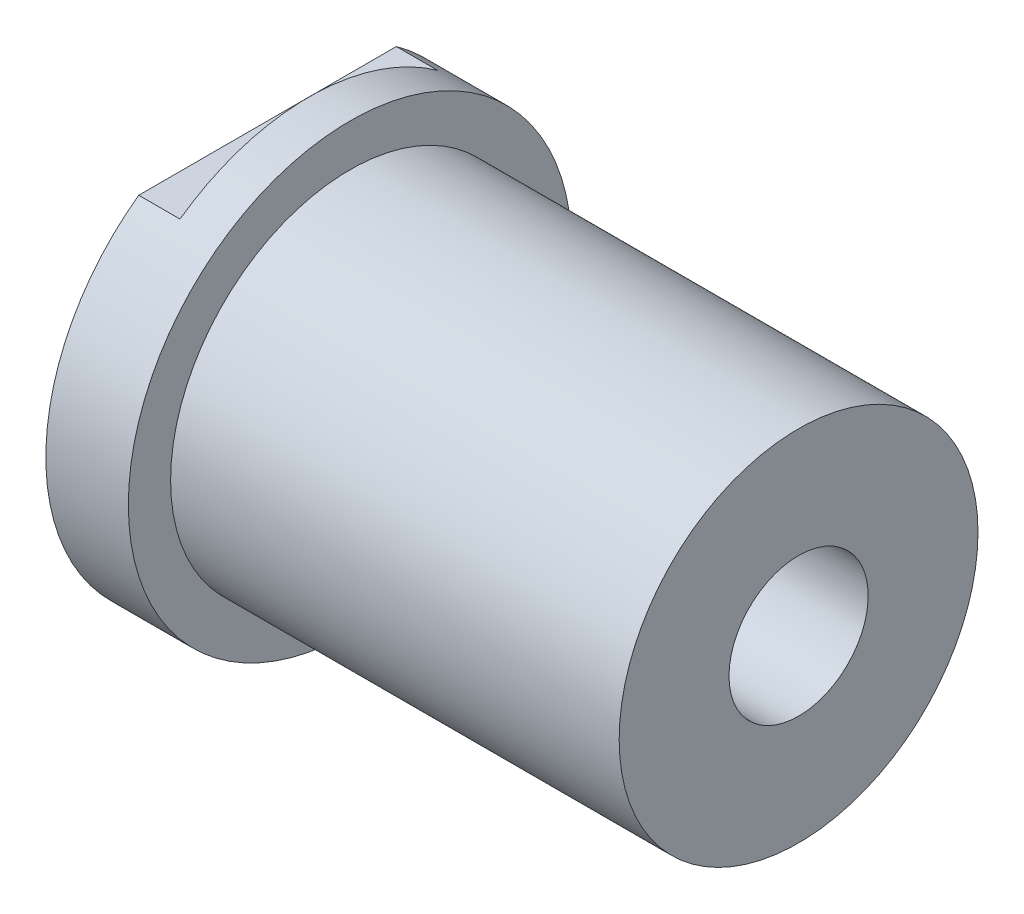
ISO-10303-21;
HEADER;
FILE_DESCRIPTION(('STEP AP214'),'2;1');
FILE_NAME('part.step','',(''),(''),'','','');
FILE_SCHEMA(('AUTOMOTIVE_DESIGN { 1 0 10303 214 1 1 1 1 }'));
ENDSEC;
DATA;
#1=APPLICATION_CONTEXT('core data for automotive mechanical design processes');
#2=APPLICATION_PROTOCOL_DEFINITION('international standard','automotive_design',2000,#1);
#3=PRODUCT_CONTEXT('',#1,'mechanical');
#4=PRODUCT('Part','Part','',(#3));
#5=PRODUCT_RELATED_PRODUCT_CATEGORY('part','',(#4));
#6=PRODUCT_DEFINITION_FORMATION('','',#4);
#7=PRODUCT_DEFINITION_CONTEXT('part definition',#1,'design');
#8=PRODUCT_DEFINITION('design','',#6,#7);
#9=PRODUCT_DEFINITION_SHAPE('','',#8);
#10=(LENGTH_UNIT() NAMED_UNIT(*) SI_UNIT(.MILLI.,.METRE.));
#11=(NAMED_UNIT(*) PLANE_ANGLE_UNIT() SI_UNIT($,.RADIAN.));
#12=(NAMED_UNIT(*) SI_UNIT($,.STERADIAN.) SOLID_ANGLE_UNIT());
#13=UNCERTAINTY_MEASURE_WITH_UNIT(LENGTH_MEASURE(1.E-05),#10,'distance_accuracy_value','');
#14=(GEOMETRIC_REPRESENTATION_CONTEXT(3) GLOBAL_UNCERTAINTY_ASSIGNED_CONTEXT((#13)) GLOBAL_UNIT_ASSIGNED_CONTEXT((#10,
#11,#12)) REPRESENTATION_CONTEXT('',''));
#15=CARTESIAN_POINT('',(0.,0.,0.));
#16=DIRECTION('',(0.,0.,1.));
#17=DIRECTION('',(1.,0.,0.));
#18=AXIS2_PLACEMENT_3D('',#15,#16,#17);
#19=CARTESIAN_POINT('',(0.,0.,0.));
#20=DIRECTION('',(-1.,0.,0.));
#21=DIRECTION('',(0.,0.,1.));
#22=AXIS2_PLACEMENT_3D('',#19,#20,#21);
#23=PLANE('',#22);
#24=CARTESIAN_POINT('',(0.,0.,0.));
#25=DIRECTION('',(-1.,0.,0.));
#26=DIRECTION('',(0.,0.,1.));
#27=AXIS2_PLACEMENT_3D('',#24,#25,#26);
#28=CIRCLE('',#27,19.5);
#29=CARTESIAN_POINT('',(0.,0.,19.5));
#30=VERTEX_POINT('',#29);
#31=EDGE_CURVE('E158',#30,#30,#28,.T.);
#32=ORIENTED_EDGE('',*,*,#31,.F.);
#33=EDGE_LOOP('',(#32));
#34=FACE_BOUND('',#33,.T.);
#35=CARTESIAN_POINT('',(0.,0.,0.));
#36=DIRECTION('',(1.,0.,0.));
#37=DIRECTION('',(0.,0.,-1.));
#38=AXIS2_PLACEMENT_3D('',#35,#36,#37);
#39=CIRCLE('',#38,43.);
#40=CARTESIAN_POINT('',(0.,-35.,-24.9799919935936));
#41=VERTEX_POINT('',#40);
#42=CARTESIAN_POINT('',(0.,35.,-24.9799919935936));
#43=VERTEX_POINT('',#42);
#44=EDGE_CURVE('E49',#41,#43,#39,.T.);
#45=ORIENTED_EDGE('',*,*,#44,.F.);
#46=DIRECTION('',(0.,0.,1.));
#47=VECTOR('',#46,1.);
#48=CARTESIAN_POINT('',(0.,-35.,-24.9799919935936));
#49=LINE('',#48,#47);
#50=CARTESIAN_POINT('',(0.,-35.,24.9799919935936));
#51=VERTEX_POINT('',#50);
#52=EDGE_CURVE('E102',#41,#51,#49,.T.);
#53=ORIENTED_EDGE('',*,*,#52,.T.);
#54=CARTESIAN_POINT('',(0.,35.,24.9799919935936));
#55=VERTEX_POINT('',#54);
#56=EDGE_CURVE('E12',#55,#51,#39,.T.);
#57=ORIENTED_EDGE('',*,*,#56,.F.);
#58=DIRECTION('',(0.,0.,1.));
#59=VECTOR('',#58,1.);
#60=CARTESIAN_POINT('',(0.,35.,-24.9799919935936));
#61=LINE('',#60,#59);
#62=EDGE_CURVE('E118',#43,#55,#61,.T.);
#63=ORIENTED_EDGE('',*,*,#62,.F.);
#64=EDGE_LOOP('',(#45,#53,#57,#63));
#65=FACE_BOUND('',#64,.T.);
#66=ADVANCED_FACE('F40',(#34,#65),#23,.T.);
#67=CARTESIAN_POINT('',(103.,0.,0.));
#68=DIRECTION('',(1.,0.,0.));
#69=DIRECTION('',(0.,0.,-1.));
#70=AXIS2_PLACEMENT_3D('',#67,#68,#69);
#71=CYLINDRICAL_SURFACE('',#70,43.);
#72=DIRECTION('',(1.,0.,0.));
#73=VECTOR('',#72,1.);
#74=CARTESIAN_POINT('',(-219.22113969155,-35.,-24.9799919935936));
#75=LINE('',#74,#73);
#76=CARTESIAN_POINT('',(7.99999999999999,-35.,-24.9799919935936));
#77=VERTEX_POINT('',#76);
#78=EDGE_CURVE('E56',#41,#77,#75,.T.);
#79=ORIENTED_EDGE('',*,*,#78,.F.);
#80=ORIENTED_EDGE('',*,*,#44,.T.);
#81=DIRECTION('',(1.,0.,0.));
#82=VECTOR('',#81,1.);
#83=CARTESIAN_POINT('',(-199.22113969155,35.,-24.9799919935936));
#84=LINE('',#83,#82);
#85=CARTESIAN_POINT('',(8.,35.,-24.9799919935936));
#86=VERTEX_POINT('',#85);
#87=EDGE_CURVE('E114',#43,#86,#84,.T.);
#88=ORIENTED_EDGE('',*,*,#87,.T.);
#89=CARTESIAN_POINT('',(8.,0.,0.));
#90=DIRECTION('',(1.,0.,0.));
#91=DIRECTION('',(0.,0.,-1.));
#92=AXIS2_PLACEMENT_3D('',#89,#90,#91);
#93=CIRCLE('',#92,43.);
#94=CARTESIAN_POINT('',(7.99999999999999,35.,24.9799919935936));
#95=VERTEX_POINT('',#94);
#96=EDGE_CURVE('E107',#86,#95,#93,.T.);
#97=ORIENTED_EDGE('',*,*,#96,.T.);
#98=DIRECTION('',(1.,0.,0.));
#99=VECTOR('',#98,1.);
#100=CARTESIAN_POINT('',(-199.22113969155,35.,24.9799919935936));
#101=LINE('',#100,#99);
#102=EDGE_CURVE('E64',#55,#95,#101,.T.);
#103=ORIENTED_EDGE('',*,*,#102,.F.);
#104=ORIENTED_EDGE('',*,*,#56,.T.);
#105=DIRECTION('',(1.,0.,0.));
#106=VECTOR('',#105,1.);
#107=CARTESIAN_POINT('',(-219.22113969155,-35.,24.9799919935936));
#108=LINE('',#107,#106);
#109=CARTESIAN_POINT('',(7.99999999999998,-35.,24.9799919935936));
#110=VERTEX_POINT('',#109);
#111=EDGE_CURVE('E92',#51,#110,#108,.T.);
#112=ORIENTED_EDGE('',*,*,#111,.T.);
#113=CARTESIAN_POINT('',(8.,0.,0.));
#114=DIRECTION('',(1.,0.,0.));
#115=DIRECTION('',(0.,0.,-1.));
#116=AXIS2_PLACEMENT_3D('',#113,#114,#115);
#117=CIRCLE('',#116,43.);
#118=EDGE_CURVE('E83',#110,#77,#117,.T.);
#119=ORIENTED_EDGE('',*,*,#118,.T.);
#120=EDGE_LOOP('',(#79,#80,#88,#97,#103,#104,#112,#119));
#121=FACE_BOUND('',#120,.T.);
#122=CARTESIAN_POINT('',(16.,0.,0.));
#123=DIRECTION('',(1.,0.,0.));
#124=DIRECTION('',(0.,0.,-1.));
#125=AXIS2_PLACEMENT_3D('',#122,#123,#124);
#126=CIRCLE('',#125,43.);
#127=CARTESIAN_POINT('',(16.,0.,-43.));
#128=VERTEX_POINT('',#127);
#129=EDGE_CURVE('E43',#128,#128,#126,.F.);
#130=ORIENTED_EDGE('',*,*,#129,.T.);
#131=EDGE_LOOP('',(#130));
#132=FACE_BOUND('',#131,.T.);
#133=ADVANCED_FACE('F96',(#121,#132),#71,.T.);
#134=CARTESIAN_POINT('',(16.,0.,0.));
#135=DIRECTION('',(1.,0.,0.));
#136=DIRECTION('',(0.,0.,-1.));
#137=AXIS2_PLACEMENT_3D('',#134,#135,#136);
#138=PLANE('',#137);
#139=ORIENTED_EDGE('',*,*,#129,.F.);
#140=EDGE_LOOP('',(#139));
#141=FACE_BOUND('',#140,.T.);
#142=CARTESIAN_POINT('',(16.,0.,0.));
#143=DIRECTION('',(1.,0.,0.));
#144=DIRECTION('',(0.,0.,-1.));
#145=AXIS2_PLACEMENT_3D('',#142,#143,#144);
#146=CIRCLE('',#145,34.8);
#147=CARTESIAN_POINT('',(16.,0.,-34.8));
#148=VERTEX_POINT('',#147);
#149=EDGE_CURVE('E125',#148,#148,#146,.T.);
#150=ORIENTED_EDGE('',*,*,#149,.F.);
#151=EDGE_LOOP('',(#150));
#152=FACE_BOUND('',#151,.T.);
#153=ADVANCED_FACE('F137',(#141,#152),#138,.T.);
#154=CARTESIAN_POINT('',(16.,0.,0.));
#155=DIRECTION('',(1.,0.,0.));
#156=DIRECTION('',(0.,0.,-1.));
#157=AXIS2_PLACEMENT_3D('',#154,#155,#156);
#158=CYLINDRICAL_SURFACE('',#157,34.8);
#159=ORIENTED_EDGE('',*,*,#149,.T.);
#160=EDGE_LOOP('',(#159));
#161=FACE_BOUND('',#160,.T.);
#162=CARTESIAN_POINT('',(103.,0.,0.));
#163=DIRECTION('',(1.,0.,0.));
#164=DIRECTION('',(0.,0.,-1.));
#165=AXIS2_PLACEMENT_3D('',#162,#163,#164);
#166=CIRCLE('',#165,34.8);
#167=CARTESIAN_POINT('',(103.,0.,-34.8));
#168=VERTEX_POINT('',#167);
#169=EDGE_CURVE('E121',#168,#168,#166,.T.);
#170=ORIENTED_EDGE('',*,*,#169,.F.);
#171=EDGE_LOOP('',(#170));
#172=FACE_BOUND('',#171,.T.);
#173=ADVANCED_FACE('F135',(#161,#172),#158,.T.);
#174=CARTESIAN_POINT('',(103.,43.,0.));
#175=DIRECTION('',(1.,0.,0.));
#176=DIRECTION('',(0.,0.,-1.));
#177=AXIS2_PLACEMENT_3D('',#174,#175,#176);
#178=PLANE('',#177);
#179=CARTESIAN_POINT('',(103.,0.,0.));
#180=DIRECTION('',(-1.,0.,0.));
#181=DIRECTION('',(0.,0.,1.));
#182=AXIS2_PLACEMENT_3D('',#179,#180,#181);
#183=CIRCLE('',#182,13.5);
#184=CARTESIAN_POINT('',(103.,0.,13.5));
#185=VERTEX_POINT('',#184);
#186=EDGE_CURVE('E196',#185,#185,#183,.T.);
#187=ORIENTED_EDGE('',*,*,#186,.T.);
#188=EDGE_LOOP('',(#187));
#189=FACE_BOUND('',#188,.T.);
#190=ORIENTED_EDGE('',*,*,#169,.T.);
#191=EDGE_LOOP('',(#190));
#192=FACE_BOUND('',#191,.T.);
#193=ADVANCED_FACE('F133',(#189,#192),#178,.T.);
#194=CARTESIAN_POINT('',(-199.22113969155,35.,-24.9799919935936));
#195=DIRECTION('',(0.,1.,0.));
#196=DIRECTION('',(0.,0.,1.));
#197=AXIS2_PLACEMENT_3D('',#194,#195,#196);
#198=PLANE('',#197);
#199=ORIENTED_EDGE('',*,*,#87,.F.);
#200=ORIENTED_EDGE('',*,*,#62,.T.);
#201=ORIENTED_EDGE('',*,*,#102,.T.);
#202=DIRECTION('',(0.,0.,1.));
#203=VECTOR('',#202,1.);
#204=CARTESIAN_POINT('',(8.00000000000001,35.,-24.9799919935936));
#205=LINE('',#204,#203);
#206=EDGE_CURVE('E109',#86,#95,#205,.T.);
#207=ORIENTED_EDGE('',*,*,#206,.F.);
#208=EDGE_LOOP('',(#199,#200,#201,#207));
#209=FACE_BOUND('',#208,.T.);
#210=ADVANCED_FACE('F144',(#209),#198,.T.);
#211=CARTESIAN_POINT('',(8.,0.,0.));
#212=DIRECTION('',(-1.,0.,0.));
#213=DIRECTION('',(0.,0.,1.));
#214=AXIS2_PLACEMENT_3D('',#211,#212,#213);
#215=PLANE('',#214);
#216=ORIENTED_EDGE('',*,*,#206,.T.);
#217=ORIENTED_EDGE('',*,*,#96,.F.);
#218=EDGE_LOOP('',(#216,#217));
#219=FACE_BOUND('',#218,.T.);
#220=ADVANCED_FACE('F169',(#219),#215,.T.);
#221=CARTESIAN_POINT('',(-219.22113969155,-35.,-24.9799919935936));
#222=DIRECTION('',(0.,1.,0.));
#223=DIRECTION('',(0.,0.,1.));
#224=AXIS2_PLACEMENT_3D('',#221,#222,#223);
#225=PLANE('',#224);
#226=ORIENTED_EDGE('',*,*,#78,.T.);
#227=DIRECTION('',(0.,0.,1.));
#228=VECTOR('',#227,1.);
#229=CARTESIAN_POINT('',(8.00000000000001,-35.,-24.9799919935936));
#230=LINE('',#229,#228);
#231=EDGE_CURVE('E85',#77,#110,#230,.T.);
#232=ORIENTED_EDGE('',*,*,#231,.T.);
#233=ORIENTED_EDGE('',*,*,#111,.F.);
#234=ORIENTED_EDGE('',*,*,#52,.F.);
#235=EDGE_LOOP('',(#226,#232,#233,#234));
#236=FACE_BOUND('',#235,.T.);
#237=ADVANCED_FACE('F91',(#236),#225,.F.);
#238=CARTESIAN_POINT('',(8.,0.,0.));
#239=DIRECTION('',(-1.,0.,0.));
#240=DIRECTION('',(0.,0.,1.));
#241=AXIS2_PLACEMENT_3D('',#238,#239,#240);
#242=PLANE('',#241);
#243=ORIENTED_EDGE('',*,*,#118,.F.);
#244=ORIENTED_EDGE('',*,*,#231,.F.);
#245=EDGE_LOOP('',(#243,#244));
#246=FACE_BOUND('',#245,.T.);
#247=ADVANCED_FACE('F84',(#246),#242,.T.);
#248=CARTESIAN_POINT('',(24.,0.,0.));
#249=DIRECTION('',(-1.,0.,0.));
#250=DIRECTION('',(0.,0.,1.));
#251=AXIS2_PLACEMENT_3D('',#248,#249,#250);
#252=CYLINDRICAL_SURFACE('',#251,19.5);
#253=CARTESIAN_POINT('',(24.,0.,0.));
#254=DIRECTION('',(-1.,0.,0.));
#255=DIRECTION('',(0.,0.,1.));
#256=AXIS2_PLACEMENT_3D('',#253,#254,#255);
#257=CIRCLE('',#256,19.5);
#258=CARTESIAN_POINT('',(24.,0.,19.5));
#259=VERTEX_POINT('',#258);
#260=EDGE_CURVE('E89',#259,#259,#257,.T.);
#261=ORIENTED_EDGE('',*,*,#260,.F.);
#262=EDGE_LOOP('',(#261));
#263=FACE_BOUND('',#262,.T.);
#264=ORIENTED_EDGE('',*,*,#31,.T.);
#265=EDGE_LOOP('',(#264));
#266=FACE_BOUND('',#265,.T.);
#267=ADVANCED_FACE('F179',(#263,#266),#252,.F.);
#268=CARTESIAN_POINT('',(24.,0.,0.));
#269=DIRECTION('',(-1.,0.,0.));
#270=DIRECTION('',(0.,0.,1.));
#271=AXIS2_PLACEMENT_3D('',#268,#269,#270);
#272=PLANE('',#271);
#273=CARTESIAN_POINT('',(24.,0.,0.));
#274=DIRECTION('',(-1.,0.,0.));
#275=DIRECTION('',(0.,0.,1.));
#276=AXIS2_PLACEMENT_3D('',#273,#274,#275);
#277=CIRCLE('',#276,13.5);
#278=CARTESIAN_POINT('',(24.,0.,13.5));
#279=VERTEX_POINT('',#278);
#280=EDGE_CURVE('E199',#279,#279,#277,.T.);
#281=ORIENTED_EDGE('',*,*,#280,.F.);
#282=EDGE_LOOP('',(#281));
#283=FACE_BOUND('',#282,.T.);
#284=ORIENTED_EDGE('',*,*,#260,.T.);
#285=EDGE_LOOP('',(#284));
#286=FACE_BOUND('',#285,.T.);
#287=ADVANCED_FACE('F183',(#283,#286),#272,.T.);
#288=CARTESIAN_POINT('',(103.,0.,0.));
#289=DIRECTION('',(-1.,0.,0.));
#290=DIRECTION('',(0.,0.,1.));
#291=AXIS2_PLACEMENT_3D('',#288,#289,#290);
#292=CYLINDRICAL_SURFACE('',#291,13.5);
#293=ORIENTED_EDGE('',*,*,#186,.F.);
#294=EDGE_LOOP('',(#293));
#295=FACE_BOUND('',#294,.T.);
#296=ORIENTED_EDGE('',*,*,#280,.T.);
#297=EDGE_LOOP('',(#296));
#298=FACE_BOUND('',#297,.T.);
#299=ADVANCED_FACE('F187',(#295,#298),#292,.F.);
#300=CLOSED_SHELL('',(#66,#133,#153,#173,#193,#210,#220,#237,#247,#267,#287,#299));
#301=MANIFOLD_SOLID_BREP('B2',#300);
#302=ADVANCED_BREP_SHAPE_REPRESENTATION('',(#18,#301),#14);
#303=SHAPE_DEFINITION_REPRESENTATION(#9,#302);
ENDSEC;
END-ISO-10303-21;
